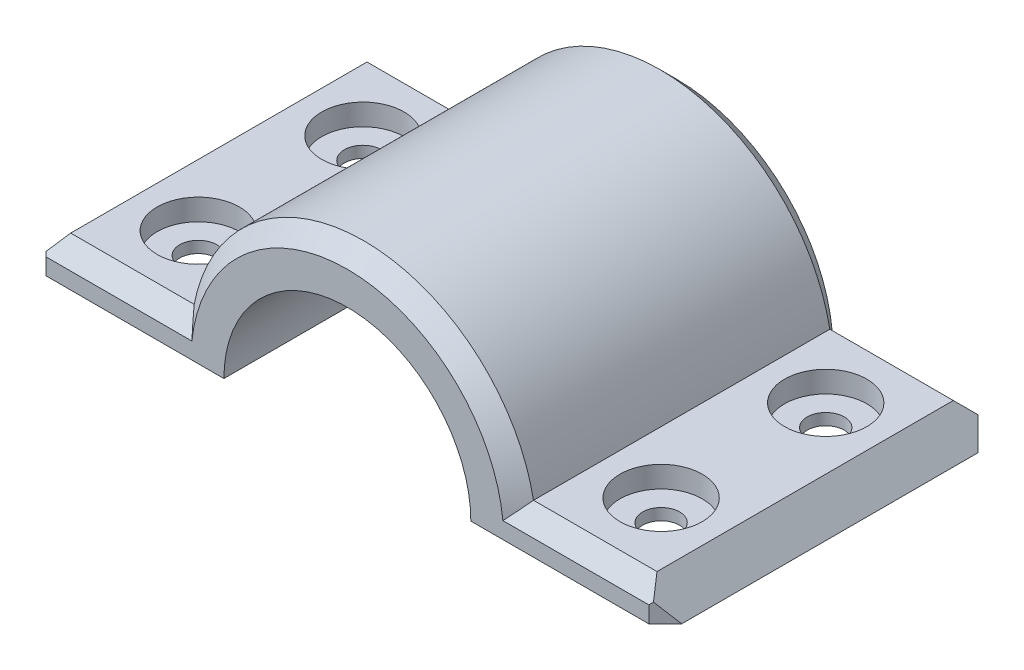
ISO-10303-21;
HEADER;
FILE_DESCRIPTION(('STEP AP214'),'2;1');
FILE_NAME('part.step','',(''),(''),'','','');
FILE_SCHEMA(('AUTOMOTIVE_DESIGN { 1 0 10303 214 1 1 1 1 }'));
ENDSEC;
DATA;
#1=APPLICATION_CONTEXT('core data for automotive mechanical design processes');
#2=APPLICATION_PROTOCOL_DEFINITION('international standard','automotive_design',2000,#1);
#3=PRODUCT_CONTEXT('',#1,'mechanical');
#4=PRODUCT('Part','Part','',(#3));
#5=PRODUCT_RELATED_PRODUCT_CATEGORY('part','',(#4));
#6=PRODUCT_DEFINITION_FORMATION('','',#4);
#7=PRODUCT_DEFINITION_CONTEXT('part definition',#1,'design');
#8=PRODUCT_DEFINITION('design','',#6,#7);
#9=PRODUCT_DEFINITION_SHAPE('','',#8);
#10=(LENGTH_UNIT() NAMED_UNIT(*) SI_UNIT(.MILLI.,.METRE.));
#11=(NAMED_UNIT(*) PLANE_ANGLE_UNIT() SI_UNIT($,.RADIAN.));
#12=(NAMED_UNIT(*) SI_UNIT($,.STERADIAN.) SOLID_ANGLE_UNIT());
#13=UNCERTAINTY_MEASURE_WITH_UNIT(LENGTH_MEASURE(1.E-05),#10,'distance_accuracy_value','');
#14=(GEOMETRIC_REPRESENTATION_CONTEXT(3) GLOBAL_UNCERTAINTY_ASSIGNED_CONTEXT((#13)) GLOBAL_UNIT_ASSIGNED_CONTEXT((#10,
#11,#12)) REPRESENTATION_CONTEXT('',''));
#15=CARTESIAN_POINT('',(0.,0.,0.));
#16=DIRECTION('',(0.,0.,1.));
#17=DIRECTION('',(1.,0.,0.));
#18=AXIS2_PLACEMENT_3D('',#15,#16,#17);
#19=CARTESIAN_POINT('',(0.,0.,40.));
#20=DIRECTION('',(0.,0.,-1.));
#21=DIRECTION('',(-1.,0.,0.));
#22=AXIS2_PLACEMENT_3D('',#19,#20,#21);
#23=CYLINDRICAL_SURFACE('',#22,15.);
#24=CARTESIAN_POINT('',(0.,0.,0.));
#25=DIRECTION('',(0.,0.,-1.));
#26=DIRECTION('',(1.,0.,0.));
#27=AXIS2_PLACEMENT_3D('',#24,#25,#26);
#28=CIRCLE('',#27,15.);
#29=CARTESIAN_POINT('',(-15.,-1.04744440165294E-13,0.));
#30=VERTEX_POINT('',#29);
#31=CARTESIAN_POINT('',(15.,0.,0.));
#32=VERTEX_POINT('',#31);
#33=EDGE_CURVE('E203',#30,#32,#28,.T.);
#34=ORIENTED_EDGE('',*,*,#33,.T.);
#35=DIRECTION('',(0.,0.,-1.));
#36=VECTOR('',#35,1.);
#37=CARTESIAN_POINT('',(15.,0.,40.));
#38=LINE('',#37,#36);
#39=CARTESIAN_POINT('',(15.,0.,40.));
#40=VERTEX_POINT('',#39);
#41=EDGE_CURVE('E196',#40,#32,#38,.T.);
#42=ORIENTED_EDGE('',*,*,#41,.F.);
#43=CARTESIAN_POINT('',(0.,0.,40.));
#44=DIRECTION('',(0.,0.,-1.));
#45=DIRECTION('',(1.,0.,0.));
#46=AXIS2_PLACEMENT_3D('',#43,#44,#45);
#47=CIRCLE('',#46,15.);
#48=CARTESIAN_POINT('',(-15.,-1.04744440165294E-13,40.));
#49=VERTEX_POINT('',#48);
#50=EDGE_CURVE('E400',#49,#40,#47,.T.);
#51=ORIENTED_EDGE('',*,*,#50,.F.);
#52=DIRECTION('',(0.,0.,-1.));
#53=VECTOR('',#52,1.);
#54=CARTESIAN_POINT('',(-15.,-1.04744440165294E-13,40.));
#55=LINE('',#54,#53);
#56=EDGE_CURVE('E176',#49,#30,#55,.T.);
#57=ORIENTED_EDGE('',*,*,#56,.T.);
#58=EDGE_LOOP('',(#34,#42,#51,#57));
#59=FACE_BOUND('',#58,.T.);
#60=ADVANCED_FACE('F39',(#59),#23,.F.);
#61=CARTESIAN_POINT('',(15.,0.,40.));
#62=DIRECTION('',(0.,1.,0.));
#63=DIRECTION('',(0.,0.,1.));
#64=AXIS2_PLACEMENT_3D('',#61,#62,#63);
#65=PLANE('',#64);
#66=CARTESIAN_POINT('',(28.1155281280883,0.,30.));
#67=DIRECTION('',(0.,1.,0.));
#68=DIRECTION('',(0.,0.,1.));
#69=AXIS2_PLACEMENT_3D('',#66,#67,#68);
#70=CIRCLE('',#69,2.24999999999999);
#71=CARTESIAN_POINT('',(28.1155281280883,0.,32.25));
#72=VERTEX_POINT('',#71);
#73=EDGE_CURVE('E205',#72,#72,#70,.T.);
#74=ORIENTED_EDGE('',*,*,#73,.T.);
#75=EDGE_LOOP('',(#74));
#76=FACE_BOUND('',#75,.T.);
#77=CARTESIAN_POINT('',(28.1155281280883,0.,10.));
#78=DIRECTION('',(0.,1.,0.));
#79=DIRECTION('',(0.,0.,1.));
#80=AXIS2_PLACEMENT_3D('',#77,#78,#79);
#81=CIRCLE('',#80,2.24999999999999);
#82=CARTESIAN_POINT('',(28.1155281280883,0.,12.25));
#83=VERTEX_POINT('',#82);
#84=EDGE_CURVE('E200',#83,#83,#81,.T.);
#85=ORIENTED_EDGE('',*,*,#84,.T.);
#86=EDGE_LOOP('',(#85));
#87=FACE_BOUND('',#86,.T.);
#88=DIRECTION('',(0.,0.,-1.));
#89=VECTOR('',#88,1.);
#90=CARTESIAN_POINT('',(38.6155281280883,0.,40.));
#91=LINE('',#90,#89);
#92=CARTESIAN_POINT('',(38.6155281280883,-1.71275520645796E-13,38.));
#93=VERTEX_POINT('',#92);
#94=CARTESIAN_POINT('',(38.6155281280883,-1.71275520645796E-13,2.));
#95=VERTEX_POINT('',#94);
#96=EDGE_CURVE('E193',#93,#95,#91,.T.);
#97=ORIENTED_EDGE('',*,*,#96,.F.);
#98=DIRECTION('',(0.707106781186547,0.,-0.707106781186547));
#99=VECTOR('',#98,1.);
#100=CARTESIAN_POINT('',(38.6155281280883,-1.71275520645796E-13,38.));
#101=LINE('',#100,#99);
#102=CARTESIAN_POINT('',(36.6155281280883,-1.62404709915063E-13,40.));
#103=VERTEX_POINT('',#102);
#104=EDGE_CURVE('E355',#103,#93,#101,.T.);
#105=ORIENTED_EDGE('',*,*,#104,.F.);
#106=DIRECTION('',(1.,0.,0.));
#107=VECTOR('',#106,1.);
#108=CARTESIAN_POINT('',(15.,0.,40.));
#109=LINE('',#108,#107);
#110=EDGE_CURVE('E403',#40,#103,#109,.T.);
#111=ORIENTED_EDGE('',*,*,#110,.F.);
#112=ORIENTED_EDGE('',*,*,#41,.T.);
#113=DIRECTION('',(1.,0.,0.));
#114=VECTOR('',#113,1.);
#115=CARTESIAN_POINT('',(15.,0.,0.));
#116=LINE('',#115,#114);
#117=CARTESIAN_POINT('',(36.6155281280883,-1.62404709915063E-13,0.));
#118=VERTEX_POINT('',#117);
#119=EDGE_CURVE('E359',#32,#118,#116,.T.);
#120=ORIENTED_EDGE('',*,*,#119,.T.);
#121=DIRECTION('',(-0.707106781186548,0.,-0.707106781186547));
#122=VECTOR('',#121,1.);
#123=CARTESIAN_POINT('',(36.6155281280883,-1.62404709915063E-13,0.));
#124=LINE('',#123,#122);
#125=EDGE_CURVE('E358',#95,#118,#124,.T.);
#126=ORIENTED_EDGE('',*,*,#125,.F.);
#127=EDGE_LOOP('',(#97,#105,#111,#112,#120,#126));
#128=FACE_BOUND('',#127,.T.);
#129=ADVANCED_FACE('F354',(#76,#87,#128),#65,.F.);
#130=CARTESIAN_POINT('',(38.6155281280883,0.,40.));
#131=DIRECTION('',(-0.8,-0.6,0.));
#132=DIRECTION('',(0.6,-0.8,0.));
#133=AXIS2_PLACEMENT_3D('',#130,#131,#132);
#134=PLANE('',#133);
#135=DIRECTION('',(0.468521285665818,-0.624695047554424,0.624695047554424));
#136=VECTOR('',#135,1.);
#137=CARTESIAN_POINT('',(28.9682170755811,12.8630814033429,29.1369185966571));
#138=LINE('',#137,#136);
#139=CARTESIAN_POINT('',(35.6155281280883,4.,38.));
#140=VERTEX_POINT('',#139);
#141=CARTESIAN_POINT('',(36.9012424138026,2.28571428571428,39.7142857142857));
#142=VERTEX_POINT('',#141);
#143=EDGE_CURVE('E231',#140,#142,#138,.T.);
#144=ORIENTED_EDGE('',*,*,#143,.T.);
#145=DIRECTION('',(0.514495755427526,-0.685994340570034,-0.514495755427529));
#146=VECTOR('',#145,1.);
#147=CARTESIAN_POINT('',(38.0861163633824,0.70588235294118,38.5294117647059));
#148=LINE('',#147,#146);
#149=EDGE_CURVE('E348',#142,#93,#148,.T.);
#150=ORIENTED_EDGE('',*,*,#149,.T.);
#151=ORIENTED_EDGE('',*,*,#96,.T.);
#152=DIRECTION('',(-0.514495755427526,0.685994340570034,-0.514495755427529));
#153=VECTOR('',#152,1.);
#154=CARTESIAN_POINT('',(48.6743516575001,-13.4117647058824,12.0588235294119));
#155=LINE('',#154,#153);
#156=CARTESIAN_POINT('',(36.9012424138026,2.28571428571427,0.285714285714287));
#157=VERTEX_POINT('',#156);
#158=EDGE_CURVE('E170',#95,#157,#155,.T.);
#159=ORIENTED_EDGE('',*,*,#158,.T.);
#160=DIRECTION('',(0.468521285665818,-0.624695047554424,-0.624695047554424));
#161=VECTOR('',#160,1.);
#162=CARTESIAN_POINT('',(35.6155281280883,4.,2.00000000000002));
#163=LINE('',#162,#161);
#164=CARTESIAN_POINT('',(35.6155281280883,4.,2.00000000000002));
#165=VERTEX_POINT('',#164);
#166=EDGE_CURVE('E234',#157,#165,#163,.F.);
#167=ORIENTED_EDGE('',*,*,#166,.T.);
#168=DIRECTION('',(0.,0.,-1.));
#169=VECTOR('',#168,1.);
#170=CARTESIAN_POINT('',(35.6155281280883,4.,40.));
#171=LINE('',#170,#169);
#172=EDGE_CURVE('E190',#140,#165,#171,.T.);
#173=ORIENTED_EDGE('',*,*,#172,.F.);
#174=EDGE_LOOP('',(#144,#150,#151,#159,#167,#173));
#175=FACE_BOUND('',#174,.T.);
#176=ADVANCED_FACE('F324',(#175),#134,.F.);
#177=CARTESIAN_POINT('',(35.6155281280883,4.,40.));
#178=DIRECTION('',(0.,-1.,0.));
#179=DIRECTION('',(1.,0.,0.));
#180=AXIS2_PLACEMENT_3D('',#177,#178,#179);
#181=PLANE('',#180);
#182=CARTESIAN_POINT('',(28.1155281280883,4.,30.));
#183=DIRECTION('',(0.,1.,0.));
#184=DIRECTION('',(0.,0.,1.));
#185=AXIS2_PLACEMENT_3D('',#182,#183,#184);
#186=CIRCLE('',#185,5.);
#187=CARTESIAN_POINT('',(28.1155281280883,4.,35.));
#188=VERTEX_POINT('',#187);
#189=EDGE_CURVE('E213',#188,#188,#186,.T.);
#190=ORIENTED_EDGE('',*,*,#189,.F.);
#191=EDGE_LOOP('',(#190));
#192=FACE_BOUND('',#191,.T.);
#193=CARTESIAN_POINT('',(28.1155281280883,4.,10.));
#194=DIRECTION('',(0.,1.,0.));
#195=DIRECTION('',(0.,0.,1.));
#196=AXIS2_PLACEMENT_3D('',#193,#194,#195);
#197=CIRCLE('',#196,5.);
#198=CARTESIAN_POINT('',(28.1155281280883,4.,15.));
#199=VERTEX_POINT('',#198);
#200=EDGE_CURVE('E208',#199,#199,#197,.T.);
#201=ORIENTED_EDGE('',*,*,#200,.F.);
#202=EDGE_LOOP('',(#201));
#203=FACE_BOUND('',#202,.T.);
#204=ORIENTED_EDGE('',*,*,#172,.T.);
#205=DIRECTION('',(-1.,0.,0.));
#206=VECTOR('',#205,1.);
#207=CARTESIAN_POINT('',(35.6155281280883,4.,2.00000000000002));
#208=LINE('',#207,#206);
#209=CARTESIAN_POINT('',(20.6155281280883,4.,2.00000000000002));
#210=VERTEX_POINT('',#209);
#211=EDGE_CURVE('E221',#165,#210,#208,.T.);
#212=ORIENTED_EDGE('',*,*,#211,.T.);
#213=DIRECTION('',(0.,0.,-1.));
#214=VECTOR('',#213,1.);
#215=CARTESIAN_POINT('',(20.6155281280883,4.,40.));
#216=LINE('',#215,#214);
#217=CARTESIAN_POINT('',(20.6155281280883,4.,38.));
#218=VERTEX_POINT('',#217);
#219=EDGE_CURVE('E187',#218,#210,#216,.T.);
#220=ORIENTED_EDGE('',*,*,#219,.F.);
#221=DIRECTION('',(1.,0.,0.));
#222=VECTOR('',#221,1.);
#223=CARTESIAN_POINT('',(35.6155281280883,4.,38.));
#224=LINE('',#223,#222);
#225=EDGE_CURVE('E199',#218,#140,#224,.T.);
#226=ORIENTED_EDGE('',*,*,#225,.T.);
#227=EDGE_LOOP('',(#204,#212,#220,#226));
#228=FACE_BOUND('',#227,.T.);
#229=ADVANCED_FACE('F335',(#192,#203,#228),#181,.F.);
#230=CARTESIAN_POINT('',(0.,0.,40.));
#231=DIRECTION('',(0.,0.,-1.));
#232=DIRECTION('',(-1.,0.,0.));
#233=AXIS2_PLACEMENT_3D('',#230,#231,#232);
#234=CYLINDRICAL_SURFACE('',#233,21.);
#235=ORIENTED_EDGE('',*,*,#219,.T.);
#236=CARTESIAN_POINT('',(0.,0.,2.00000000000002));
#237=DIRECTION('',(0.,0.,1.));
#238=DIRECTION('',(1.,0.,0.));
#239=AXIS2_PLACEMENT_3D('',#236,#237,#238);
#240=CIRCLE('',#239,21.);
#241=CARTESIAN_POINT('',(-20.6155281280883,4.,2.00000000000002));
#242=VERTEX_POINT('',#241);
#243=EDGE_CURVE('E238',#210,#242,#240,.T.);
#244=ORIENTED_EDGE('',*,*,#243,.T.);
#245=DIRECTION('',(0.,0.,-1.));
#246=VECTOR('',#245,1.);
#247=CARTESIAN_POINT('',(-20.6155281280883,4.,40.));
#248=LINE('',#247,#246);
#249=CARTESIAN_POINT('',(-20.6155281280883,4.,38.));
#250=VERTEX_POINT('',#249);
#251=EDGE_CURVE('E178',#250,#242,#248,.T.);
#252=ORIENTED_EDGE('',*,*,#251,.F.);
#253=CARTESIAN_POINT('',(0.,0.,38.));
#254=DIRECTION('',(0.,0.,1.));
#255=DIRECTION('',(1.,0.,0.));
#256=AXIS2_PLACEMENT_3D('',#253,#254,#255);
#257=CIRCLE('',#256,21.);
#258=EDGE_CURVE('E236',#250,#218,#257,.F.);
#259=ORIENTED_EDGE('',*,*,#258,.T.);
#260=EDGE_LOOP('',(#235,#244,#252,#259));
#261=FACE_BOUND('',#260,.T.);
#262=ADVANCED_FACE('F338',(#261),#234,.T.);
#263=CARTESIAN_POINT('',(-35.6155281280883,4.,40.));
#264=DIRECTION('',(0.,-1.,0.));
#265=DIRECTION('',(0.,0.,-1.));
#266=AXIS2_PLACEMENT_3D('',#263,#264,#265);
#267=PLANE('',#266);
#268=CARTESIAN_POINT('',(-28.1155281280883,4.,10.));
#269=DIRECTION('',(0.,1.,0.));
#270=DIRECTION('',(0.,0.,1.));
#271=AXIS2_PLACEMENT_3D('',#268,#269,#270);
#272=CIRCLE('',#271,5.);
#273=CARTESIAN_POINT('',(-28.1155281280883,4.,15.));
#274=VERTEX_POINT('',#273);
#275=EDGE_CURVE('E371',#274,#274,#272,.T.);
#276=ORIENTED_EDGE('',*,*,#275,.F.);
#277=EDGE_LOOP('',(#276));
#278=FACE_BOUND('',#277,.T.);
#279=CARTESIAN_POINT('',(-28.1155281280883,4.,30.));
#280=DIRECTION('',(0.,1.,0.));
#281=DIRECTION('',(0.,0.,1.));
#282=AXIS2_PLACEMENT_3D('',#279,#280,#281);
#283=CIRCLE('',#282,5.);
#284=CARTESIAN_POINT('',(-28.1155281280883,4.,35.));
#285=VERTEX_POINT('',#284);
#286=EDGE_CURVE('E218',#285,#285,#283,.T.);
#287=ORIENTED_EDGE('',*,*,#286,.F.);
#288=EDGE_LOOP('',(#287));
#289=FACE_BOUND('',#288,.T.);
#290=ORIENTED_EDGE('',*,*,#251,.T.);
#291=DIRECTION('',(-1.,0.,0.));
#292=VECTOR('',#291,1.);
#293=CARTESIAN_POINT('',(-35.6155281280883,4.,2.00000000000002));
#294=LINE('',#293,#292);
#295=CARTESIAN_POINT('',(-35.6155281280883,4.,2.00000000000002));
#296=VERTEX_POINT('',#295);
#297=EDGE_CURVE('E242',#242,#296,#294,.T.);
#298=ORIENTED_EDGE('',*,*,#297,.T.);
#299=DIRECTION('',(0.,0.,-1.));
#300=VECTOR('',#299,1.);
#301=CARTESIAN_POINT('',(-35.6155281280883,4.,40.));
#302=LINE('',#301,#300);
#303=CARTESIAN_POINT('',(-35.6155281280883,4.,38.));
#304=VERTEX_POINT('',#303);
#305=EDGE_CURVE('E175',#304,#296,#302,.T.);
#306=ORIENTED_EDGE('',*,*,#305,.F.);
#307=DIRECTION('',(1.,0.,0.));
#308=VECTOR('',#307,1.);
#309=CARTESIAN_POINT('',(-20.6155281280883,4.,38.));
#310=LINE('',#309,#308);
#311=EDGE_CURVE('E240',#304,#250,#310,.T.);
#312=ORIENTED_EDGE('',*,*,#311,.T.);
#313=EDGE_LOOP('',(#290,#298,#306,#312));
#314=FACE_BOUND('',#313,.T.);
#315=ADVANCED_FACE('F428',(#278,#289,#314),#267,.F.);
#316=CARTESIAN_POINT('',(-38.6155281280883,0.,40.));
#317=DIRECTION('',(0.8,-0.6,0.));
#318=DIRECTION('',(0.6,0.8,0.));
#319=AXIS2_PLACEMENT_3D('',#316,#317,#318);
#320=PLANE('',#319);
#321=DIRECTION('',(0.468521285665819,0.624695047554424,0.624695047554424));
#322=VECTOR('',#321,1.);
#323=CARTESIAN_POINT('',(-35.6155281280883,4.,2.00000000000002));
#324=LINE('',#323,#322);
#325=CARTESIAN_POINT('',(-36.9012424138026,2.28571428571428,0.285714285714296));
#326=VERTEX_POINT('',#325);
#327=EDGE_CURVE('E168',#296,#326,#324,.F.);
#328=ORIENTED_EDGE('',*,*,#327,.T.);
#329=DIRECTION('',(-0.514495755427527,-0.685994340570036,0.514495755427525));
#330=VECTOR('',#329,1.);
#331=CARTESIAN_POINT('',(-48.6743516575001,-13.4117647058823,12.0588235294117));
#332=LINE('',#331,#330);
#333=CARTESIAN_POINT('',(-38.6155281280883,1.71275520645796E-13,2.));
#334=VERTEX_POINT('',#333);
#335=EDGE_CURVE('E55',#326,#334,#332,.T.);
#336=ORIENTED_EDGE('',*,*,#335,.T.);
#337=DIRECTION('',(0.,0.,-1.));
#338=VECTOR('',#337,1.);
#339=CARTESIAN_POINT('',(-38.6155281280883,0.,40.));
#340=LINE('',#339,#338);
#341=CARTESIAN_POINT('',(-38.6155281280883,1.71275520645796E-13,38.));
#342=VERTEX_POINT('',#341);
#343=EDGE_CURVE('E165',#342,#334,#340,.T.);
#344=ORIENTED_EDGE('',*,*,#343,.F.);
#345=DIRECTION('',(0.514495755427528,0.685994340570036,0.514495755427525));
#346=VECTOR('',#345,1.);
#347=CARTESIAN_POINT('',(-38.0861163633824,0.705882352941174,38.5294117647059));
#348=LINE('',#347,#346);
#349=CARTESIAN_POINT('',(-36.9012424138026,2.28571428571428,39.7142857142857));
#350=VERTEX_POINT('',#349);
#351=EDGE_CURVE('E328',#342,#350,#348,.T.);
#352=ORIENTED_EDGE('',*,*,#351,.T.);
#353=DIRECTION('',(0.468521285665819,0.624695047554424,-0.624695047554424));
#354=VECTOR('',#353,1.);
#355=CARTESIAN_POINT('',(-28.9682170755811,12.8630814033429,29.1369185966571));
#356=LINE('',#355,#354);
#357=EDGE_CURVE('E244',#350,#304,#356,.T.);
#358=ORIENTED_EDGE('',*,*,#357,.T.);
#359=ORIENTED_EDGE('',*,*,#305,.T.);
#360=EDGE_LOOP('',(#328,#336,#344,#352,#358,#359));
#361=FACE_BOUND('',#360,.T.);
#362=ADVANCED_FACE('F163',(#361),#320,.F.);
#363=CARTESIAN_POINT('',(-15.,-1.04744440165294E-13,40.));
#364=DIRECTION('',(0.,1.,0.));
#365=DIRECTION('',(-1.,0.,0.));
#366=AXIS2_PLACEMENT_3D('',#363,#364,#365);
#367=PLANE('',#366);
#368=CARTESIAN_POINT('',(-28.1155281280883,0.,10.));
#369=DIRECTION('',(0.,1.,0.));
#370=DIRECTION('',(-1.,0.,0.));
#371=AXIS2_PLACEMENT_3D('',#368,#369,#370);
#372=CIRCLE('',#371,2.24999999999999);
#373=CARTESIAN_POINT('',(-30.3655281280883,0.,10.));
#374=VERTEX_POINT('',#373);
#375=EDGE_CURVE('E215',#374,#374,#372,.T.);
#376=ORIENTED_EDGE('',*,*,#375,.T.);
#377=EDGE_LOOP('',(#376));
#378=FACE_BOUND('',#377,.T.);
#379=CARTESIAN_POINT('',(-28.1155281280883,0.,30.));
#380=DIRECTION('',(0.,1.,0.));
#381=DIRECTION('',(-1.,0.,0.));
#382=AXIS2_PLACEMENT_3D('',#379,#380,#381);
#383=CIRCLE('',#382,2.24999999999999);
#384=CARTESIAN_POINT('',(-30.3655281280883,0.,30.));
#385=VERTEX_POINT('',#384);
#386=EDGE_CURVE('E210',#385,#385,#383,.T.);
#387=ORIENTED_EDGE('',*,*,#386,.T.);
#388=EDGE_LOOP('',(#387));
#389=FACE_BOUND('',#388,.T.);
#390=ORIENTED_EDGE('',*,*,#343,.T.);
#391=DIRECTION('',(-0.707106781186547,0.,0.707106781186549));
#392=VECTOR('',#391,1.);
#393=CARTESIAN_POINT('',(-38.6155281280883,1.71275520645796E-13,2.));
#394=LINE('',#393,#392);
#395=CARTESIAN_POINT('',(-36.6155281280883,1.62404709915063E-13,0.));
#396=VERTEX_POINT('',#395);
#397=EDGE_CURVE('E151',#396,#334,#394,.T.);
#398=ORIENTED_EDGE('',*,*,#397,.F.);
#399=DIRECTION('',(1.,0.,0.));
#400=VECTOR('',#399,1.);
#401=CARTESIAN_POINT('',(-15.,-1.04744440165294E-13,0.));
#402=LINE('',#401,#400);
#403=EDGE_CURVE('E404',#396,#30,#402,.T.);
#404=ORIENTED_EDGE('',*,*,#403,.T.);
#405=ORIENTED_EDGE('',*,*,#56,.F.);
#406=DIRECTION('',(1.,0.,0.));
#407=VECTOR('',#406,1.);
#408=CARTESIAN_POINT('',(-15.,-1.04744440165294E-13,40.));
#409=LINE('',#408,#407);
#410=CARTESIAN_POINT('',(-36.6155281280883,1.62404709915063E-13,40.));
#411=VERTEX_POINT('',#410);
#412=EDGE_CURVE('E181',#411,#49,#409,.T.);
#413=ORIENTED_EDGE('',*,*,#412,.F.);
#414=DIRECTION('',(0.707106781186547,0.,0.707106781186547));
#415=VECTOR('',#414,1.);
#416=CARTESIAN_POINT('',(-38.6155281280883,1.71275520645796E-13,38.));
#417=LINE('',#416,#415);
#418=EDGE_CURVE('E158',#342,#411,#417,.T.);
#419=ORIENTED_EDGE('',*,*,#418,.F.);
#420=EDGE_LOOP('',(#390,#398,#404,#405,#413,#419));
#421=FACE_BOUND('',#420,.T.);
#422=ADVANCED_FACE('F173',(#378,#389,#421),#367,.F.);
#423=CARTESIAN_POINT('',(0.,0.,40.));
#424=DIRECTION('',(0.,0.,1.));
#425=DIRECTION('',(1.,0.,0.));
#426=AXIS2_PLACEMENT_3D('',#423,#424,#425);
#427=PLANE('',#426);
#428=DIRECTION('',(0.,-1.,0.));
#429=VECTOR('',#428,1.);
#430=CARTESIAN_POINT('',(36.6155281280883,9.99999999999984,40.));
#431=LINE('',#430,#429);
#432=CARTESIAN_POINT('',(36.6155281280883,1.99999999999999,40.));
#433=VERTEX_POINT('',#432);
#434=EDGE_CURVE('E364',#433,#103,#431,.T.);
#435=ORIENTED_EDGE('',*,*,#434,.F.);
#436=DIRECTION('',(-1.,0.,0.));
#437=VECTOR('',#436,1.);
#438=CARTESIAN_POINT('',(20.6155281280883,1.99999999999999,40.));
#439=LINE('',#438,#437);
#440=CARTESIAN_POINT('',(18.8944436276912,1.99999999999999,40.));
#441=VERTEX_POINT('',#440);
#442=EDGE_CURVE('E252',#433,#441,#439,.T.);
#443=ORIENTED_EDGE('',*,*,#442,.T.);
#444=CARTESIAN_POINT('',(0.,0.,40.));
#445=DIRECTION('',(0.,0.,1.));
#446=DIRECTION('',(1.,0.,0.));
#447=AXIS2_PLACEMENT_3D('',#444,#445,#446);
#448=CIRCLE('',#447,19.);
#449=CARTESIAN_POINT('',(-18.8944436276912,1.99999999999999,40.));
#450=VERTEX_POINT('',#449);
#451=EDGE_CURVE('E247',#441,#450,#448,.T.);
#452=ORIENTED_EDGE('',*,*,#451,.T.);
#453=DIRECTION('',(-1.,0.,0.));
#454=VECTOR('',#453,1.);
#455=CARTESIAN_POINT('',(-35.6155281280883,1.99999999999999,40.));
#456=LINE('',#455,#454);
#457=CARTESIAN_POINT('',(-36.6155281280883,1.99999999999999,40.));
#458=VERTEX_POINT('',#457);
#459=EDGE_CURVE('E249',#450,#458,#456,.T.);
#460=ORIENTED_EDGE('',*,*,#459,.T.);
#461=DIRECTION('',(0.,-1.,0.));
#462=VECTOR('',#461,1.);
#463=CARTESIAN_POINT('',(-36.6155281280883,10.0000000000002,40.));
#464=LINE('',#463,#462);
#465=EDGE_CURVE('E350',#458,#411,#464,.T.);
#466=ORIENTED_EDGE('',*,*,#465,.T.);
#467=ORIENTED_EDGE('',*,*,#412,.T.);
#468=ORIENTED_EDGE('',*,*,#50,.T.);
#469=ORIENTED_EDGE('',*,*,#110,.T.);
#470=EDGE_LOOP('',(#435,#443,#452,#460,#466,#467,#468,#469));
#471=FACE_BOUND('',#470,.T.);
#472=ADVANCED_FACE('F418',(#471),#427,.T.);
#473=CARTESIAN_POINT('',(0.,0.,0.));
#474=DIRECTION('',(0.,0.,1.));
#475=DIRECTION('',(1.,0.,0.));
#476=AXIS2_PLACEMENT_3D('',#473,#474,#475);
#477=PLANE('',#476);
#478=DIRECTION('',(1.,0.,0.));
#479=VECTOR('',#478,1.);
#480=CARTESIAN_POINT('',(0.,1.99999999999998,0.));
#481=LINE('',#480,#479);
#482=CARTESIAN_POINT('',(18.8944436276912,1.99999999999998,0.));
#483=VERTEX_POINT('',#482);
#484=CARTESIAN_POINT('',(36.6155281280883,1.99999999999999,0.));
#485=VERTEX_POINT('',#484);
#486=EDGE_CURVE('E228',#483,#485,#481,.T.);
#487=ORIENTED_EDGE('',*,*,#486,.T.);
#488=DIRECTION('',(0.,-1.,0.));
#489=VECTOR('',#488,1.);
#490=CARTESIAN_POINT('',(36.6155281280883,9.99999999999984,0.));
#491=LINE('',#490,#489);
#492=EDGE_CURVE('E63',#485,#118,#491,.T.);
#493=ORIENTED_EDGE('',*,*,#492,.T.);
#494=ORIENTED_EDGE('',*,*,#119,.F.);
#495=ORIENTED_EDGE('',*,*,#33,.F.);
#496=ORIENTED_EDGE('',*,*,#403,.F.);
#497=DIRECTION('',(0.,-1.,0.));
#498=VECTOR('',#497,1.);
#499=CARTESIAN_POINT('',(-36.6155281280883,10.0000000000002,0.));
#500=LINE('',#499,#498);
#501=CARTESIAN_POINT('',(-36.6155281280883,1.99999999999998,0.));
#502=VERTEX_POINT('',#501);
#503=EDGE_CURVE('E154',#502,#396,#500,.T.);
#504=ORIENTED_EDGE('',*,*,#503,.F.);
#505=DIRECTION('',(1.,0.,0.));
#506=VECTOR('',#505,1.);
#507=CARTESIAN_POINT('',(0.,1.99999999999998,0.));
#508=LINE('',#507,#506);
#509=CARTESIAN_POINT('',(-18.8944436276912,1.99999999999998,0.));
#510=VERTEX_POINT('',#509);
#511=EDGE_CURVE('E224',#502,#510,#508,.T.);
#512=ORIENTED_EDGE('',*,*,#511,.T.);
#513=CARTESIAN_POINT('',(0.,0.,0.));
#514=DIRECTION('',(0.,0.,1.));
#515=DIRECTION('',(1.,0.,0.));
#516=AXIS2_PLACEMENT_3D('',#513,#514,#515);
#517=CIRCLE('',#516,19.);
#518=EDGE_CURVE('E226',#510,#483,#517,.F.);
#519=ORIENTED_EDGE('',*,*,#518,.T.);
#520=EDGE_LOOP('',(#487,#493,#494,#495,#496,#504,#512,#519));
#521=FACE_BOUND('',#520,.T.);
#522=ADVANCED_FACE('F415',(#521),#477,.F.);
#523=CARTESIAN_POINT('',(28.1155281280883,4.,10.));
#524=DIRECTION('',(0.,1.,0.));
#525=DIRECTION('',(0.,0.,1.));
#526=AXIS2_PLACEMENT_3D('',#523,#524,#525);
#527=CYLINDRICAL_SURFACE('',#526,2.24999999999999);
#528=CARTESIAN_POINT('',(28.1155281280883,1.4,10.));
#529=DIRECTION('',(0.,1.,0.));
#530=DIRECTION('',(0.,0.,1.));
#531=AXIS2_PLACEMENT_3D('',#528,#529,#530);
#532=CIRCLE('',#531,2.24999999999999);
#533=CARTESIAN_POINT('',(28.1155281280883,1.4,12.25));
#534=VERTEX_POINT('',#533);
#535=EDGE_CURVE('E204',#534,#534,#532,.T.);
#536=ORIENTED_EDGE('',*,*,#535,.T.);
#537=EDGE_LOOP('',(#536));
#538=FACE_BOUND('',#537,.T.);
#539=ORIENTED_EDGE('',*,*,#84,.F.);
#540=EDGE_LOOP('',(#539));
#541=FACE_BOUND('',#540,.T.);
#542=ADVANCED_FACE('F478',(#538,#541),#527,.F.);
#543=CARTESIAN_POINT('',(30.3655281280883,1.4,10.));
#544=DIRECTION('',(0.,-1.,0.));
#545=DIRECTION('',(0.,0.,-1.));
#546=AXIS2_PLACEMENT_3D('',#543,#544,#545);
#547=PLANE('',#546);
#548=ORIENTED_EDGE('',*,*,#535,.F.);
#549=EDGE_LOOP('',(#548));
#550=FACE_BOUND('',#549,.T.);
#551=CARTESIAN_POINT('',(28.1155281280883,1.4,10.));
#552=DIRECTION('',(0.,1.,0.));
#553=DIRECTION('',(0.,0.,1.));
#554=AXIS2_PLACEMENT_3D('',#551,#552,#553);
#555=CIRCLE('',#554,5.);
#556=CARTESIAN_POINT('',(28.1155281280883,1.4,15.));
#557=VERTEX_POINT('',#556);
#558=EDGE_CURVE('E395',#557,#557,#555,.T.);
#559=ORIENTED_EDGE('',*,*,#558,.T.);
#560=EDGE_LOOP('',(#559));
#561=FACE_BOUND('',#560,.T.);
#562=ADVANCED_FACE('F468',(#550,#561),#547,.F.);
#563=CARTESIAN_POINT('',(28.1155281280883,4.,10.));
#564=DIRECTION('',(0.,1.,0.));
#565=DIRECTION('',(0.,0.,1.));
#566=AXIS2_PLACEMENT_3D('',#563,#564,#565);
#567=CYLINDRICAL_SURFACE('',#566,5.);
#568=ORIENTED_EDGE('',*,*,#558,.F.);
#569=EDGE_LOOP('',(#568));
#570=FACE_BOUND('',#569,.T.);
#571=ORIENTED_EDGE('',*,*,#200,.T.);
#572=EDGE_LOOP('',(#571));
#573=FACE_BOUND('',#572,.T.);
#574=ADVANCED_FACE('F465',(#570,#573),#567,.F.);
#575=CARTESIAN_POINT('',(28.1155281280883,4.,30.));
#576=DIRECTION('',(0.,1.,0.));
#577=DIRECTION('',(0.,0.,1.));
#578=AXIS2_PLACEMENT_3D('',#575,#576,#577);
#579=CYLINDRICAL_SURFACE('',#578,2.24999999999999);
#580=CARTESIAN_POINT('',(28.1155281280883,1.4,30.));
#581=DIRECTION('',(0.,1.,0.));
#582=DIRECTION('',(0.,0.,1.));
#583=AXIS2_PLACEMENT_3D('',#580,#581,#582);
#584=CIRCLE('',#583,2.24999999999999);
#585=CARTESIAN_POINT('',(28.1155281280883,1.4,32.25));
#586=VERTEX_POINT('',#585);
#587=EDGE_CURVE('E209',#586,#586,#584,.T.);
#588=ORIENTED_EDGE('',*,*,#587,.T.);
#589=EDGE_LOOP('',(#588));
#590=FACE_BOUND('',#589,.T.);
#591=ORIENTED_EDGE('',*,*,#73,.F.);
#592=EDGE_LOOP('',(#591));
#593=FACE_BOUND('',#592,.T.);
#594=ADVANCED_FACE('F467',(#590,#593),#579,.F.);
#595=CARTESIAN_POINT('',(30.3655281280883,1.4,30.));
#596=DIRECTION('',(0.,-1.,0.));
#597=DIRECTION('',(0.,0.,-1.));
#598=AXIS2_PLACEMENT_3D('',#595,#596,#597);
#599=PLANE('',#598);
#600=ORIENTED_EDGE('',*,*,#587,.F.);
#601=EDGE_LOOP('',(#600));
#602=FACE_BOUND('',#601,.T.);
#603=CARTESIAN_POINT('',(28.1155281280883,1.4,30.));
#604=DIRECTION('',(0.,1.,0.));
#605=DIRECTION('',(0.,0.,1.));
#606=AXIS2_PLACEMENT_3D('',#603,#604,#605);
#607=CIRCLE('',#606,5.);
#608=CARTESIAN_POINT('',(28.1155281280883,1.4,35.));
#609=VERTEX_POINT('',#608);
#610=EDGE_CURVE('E388',#609,#609,#607,.T.);
#611=ORIENTED_EDGE('',*,*,#610,.T.);
#612=EDGE_LOOP('',(#611));
#613=FACE_BOUND('',#612,.T.);
#614=ADVANCED_FACE('F475',(#602,#613),#599,.F.);
#615=CARTESIAN_POINT('',(28.1155281280883,4.,30.));
#616=DIRECTION('',(0.,1.,0.));
#617=DIRECTION('',(0.,0.,1.));
#618=AXIS2_PLACEMENT_3D('',#615,#616,#617);
#619=CYLINDRICAL_SURFACE('',#618,5.);
#620=ORIENTED_EDGE('',*,*,#610,.F.);
#621=EDGE_LOOP('',(#620));
#622=FACE_BOUND('',#621,.T.);
#623=ORIENTED_EDGE('',*,*,#189,.T.);
#624=EDGE_LOOP('',(#623));
#625=FACE_BOUND('',#624,.T.);
#626=ADVANCED_FACE('F502',(#622,#625),#619,.F.);
#627=CARTESIAN_POINT('',(-28.1155281280883,4.,30.));
#628=DIRECTION('',(0.,1.,0.));
#629=DIRECTION('',(0.,0.,1.));
#630=AXIS2_PLACEMENT_3D('',#627,#628,#629);
#631=CYLINDRICAL_SURFACE('',#630,2.24999999999999);
#632=CARTESIAN_POINT('',(-28.1155281280883,1.4,30.));
#633=DIRECTION('',(0.,1.,0.));
#634=DIRECTION('',(0.,0.,1.));
#635=AXIS2_PLACEMENT_3D('',#632,#633,#634);
#636=CIRCLE('',#635,2.24999999999999);
#637=CARTESIAN_POINT('',(-28.1155281280883,1.4,32.25));
#638=VERTEX_POINT('',#637);
#639=EDGE_CURVE('E214',#638,#638,#636,.T.);
#640=ORIENTED_EDGE('',*,*,#639,.T.);
#641=EDGE_LOOP('',(#640));
#642=FACE_BOUND('',#641,.T.);
#643=ORIENTED_EDGE('',*,*,#386,.F.);
#644=EDGE_LOOP('',(#643));
#645=FACE_BOUND('',#644,.T.);
#646=ADVANCED_FACE('F499',(#642,#645),#631,.F.);
#647=CARTESIAN_POINT('',(-25.8655281280883,1.4,30.));
#648=DIRECTION('',(0.,-1.,0.));
#649=DIRECTION('',(0.,0.,-1.));
#650=AXIS2_PLACEMENT_3D('',#647,#648,#649);
#651=PLANE('',#650);
#652=ORIENTED_EDGE('',*,*,#639,.F.);
#653=EDGE_LOOP('',(#652));
#654=FACE_BOUND('',#653,.T.);
#655=CARTESIAN_POINT('',(-28.1155281280883,1.4,30.));
#656=DIRECTION('',(0.,1.,0.));
#657=DIRECTION('',(0.,0.,1.));
#658=AXIS2_PLACEMENT_3D('',#655,#656,#657);
#659=CIRCLE('',#658,5.);
#660=CARTESIAN_POINT('',(-28.1155281280883,1.4,35.));
#661=VERTEX_POINT('',#660);
#662=EDGE_CURVE('E381',#661,#661,#659,.T.);
#663=ORIENTED_EDGE('',*,*,#662,.T.);
#664=EDGE_LOOP('',(#663));
#665=FACE_BOUND('',#664,.T.);
#666=ADVANCED_FACE('F501',(#654,#665),#651,.F.);
#667=CARTESIAN_POINT('',(-28.1155281280883,4.,30.));
#668=DIRECTION('',(0.,1.,0.));
#669=DIRECTION('',(0.,0.,1.));
#670=AXIS2_PLACEMENT_3D('',#667,#668,#669);
#671=CYLINDRICAL_SURFACE('',#670,5.);
#672=ORIENTED_EDGE('',*,*,#662,.F.);
#673=EDGE_LOOP('',(#672));
#674=FACE_BOUND('',#673,.T.);
#675=ORIENTED_EDGE('',*,*,#286,.T.);
#676=EDGE_LOOP('',(#675));
#677=FACE_BOUND('',#676,.T.);
#678=ADVANCED_FACE('F509',(#674,#677),#671,.F.);
#679=CARTESIAN_POINT('',(-28.1155281280883,4.,10.));
#680=DIRECTION('',(0.,1.,0.));
#681=DIRECTION('',(0.,0.,1.));
#682=AXIS2_PLACEMENT_3D('',#679,#680,#681);
#683=CYLINDRICAL_SURFACE('',#682,2.24999999999999);
#684=CARTESIAN_POINT('',(-28.1155281280883,1.4,10.));
#685=DIRECTION('',(0.,1.,0.));
#686=DIRECTION('',(0.,0.,1.));
#687=AXIS2_PLACEMENT_3D('',#684,#685,#686);
#688=CIRCLE('',#687,2.24999999999999);
#689=CARTESIAN_POINT('',(-28.1155281280883,1.4,12.25));
#690=VERTEX_POINT('',#689);
#691=EDGE_CURVE('E219',#690,#690,#688,.T.);
#692=ORIENTED_EDGE('',*,*,#691,.T.);
#693=EDGE_LOOP('',(#692));
#694=FACE_BOUND('',#693,.T.);
#695=ORIENTED_EDGE('',*,*,#375,.F.);
#696=EDGE_LOOP('',(#695));
#697=FACE_BOUND('',#696,.T.);
#698=ADVANCED_FACE('F556',(#694,#697),#683,.F.);
#699=CARTESIAN_POINT('',(-25.8655281280883,1.4,10.));
#700=DIRECTION('',(0.,-1.,0.));
#701=DIRECTION('',(0.,0.,-1.));
#702=AXIS2_PLACEMENT_3D('',#699,#700,#701);
#703=PLANE('',#702);
#704=ORIENTED_EDGE('',*,*,#691,.F.);
#705=EDGE_LOOP('',(#704));
#706=FACE_BOUND('',#705,.T.);
#707=CARTESIAN_POINT('',(-28.1155281280883,1.4,10.));
#708=DIRECTION('',(0.,1.,0.));
#709=DIRECTION('',(0.,0.,1.));
#710=AXIS2_PLACEMENT_3D('',#707,#708,#709);
#711=CIRCLE('',#710,5.);
#712=CARTESIAN_POINT('',(-28.1155281280883,1.4,15.));
#713=VERTEX_POINT('',#712);
#714=EDGE_CURVE('E374',#713,#713,#711,.T.);
#715=ORIENTED_EDGE('',*,*,#714,.T.);
#716=EDGE_LOOP('',(#715));
#717=FACE_BOUND('',#716,.T.);
#718=ADVANCED_FACE('F566',(#706,#717),#703,.F.);
#719=CARTESIAN_POINT('',(-28.1155281280883,4.,10.));
#720=DIRECTION('',(0.,1.,0.));
#721=DIRECTION('',(0.,0.,1.));
#722=AXIS2_PLACEMENT_3D('',#719,#720,#721);
#723=CYLINDRICAL_SURFACE('',#722,5.);
#724=ORIENTED_EDGE('',*,*,#714,.F.);
#725=EDGE_LOOP('',(#724));
#726=FACE_BOUND('',#725,.T.);
#727=ORIENTED_EDGE('',*,*,#275,.T.);
#728=EDGE_LOOP('',(#727));
#729=FACE_BOUND('',#728,.T.);
#730=ADVANCED_FACE('F290',(#726,#729),#723,.F.);
#731=CARTESIAN_POINT('',(-35.6155281280883,4.,2.00000000000002));
#732=DIRECTION('',(0.,-0.707106781186547,0.707106781186547));
#733=DIRECTION('',(-1.,0.,0.));
#734=AXIS2_PLACEMENT_3D('',#731,#732,#733);
#735=PLANE('',#734);
#736=DIRECTION('',(-0.577350269189623,0.577350269189627,0.577350269189627));
#737=VECTOR('',#736,1.);
#738=CARTESIAN_POINT('',(-37.6155281280883,3.,1.00000000000002));
#739=LINE('',#738,#737);
#740=EDGE_CURVE('E11',#326,#502,#739,.F.);
#741=ORIENTED_EDGE('',*,*,#740,.F.);
#742=ORIENTED_EDGE('',*,*,#327,.F.);
#743=ORIENTED_EDGE('',*,*,#297,.F.);
#744=CARTESIAN_POINT('',(-20.6155281280883,4.,2.00000000000002));
#745=CARTESIAN_POINT('',(-20.4765326392161,3.83144510324109,1.8314451032411));
#746=CARTESIAN_POINT('',(-20.3364898806928,3.66332109717225,1.66332109717227));
#747=CARTESIAN_POINT('',(-20.0542321690775,3.32800872149252,1.32800872149254));
#748=CARTESIAN_POINT('',(-19.9120174203462,3.1608202658545,1.16082026585452));
#749=CARTESIAN_POINT('',(-19.6253104494893,2.8274193677755,0.827419367775512));
#750=CARTESIAN_POINT('',(-19.4808182009975,2.66120693666436,0.66120693666438));
#751=CARTESIAN_POINT('',(-19.1894445896244,2.32981106722428,0.329811067224297));
#752=CARTESIAN_POINT('',(-19.0425630045422,2.16462772659598,0.164627726595993));
#753=CARTESIAN_POINT('',(-18.8944436276912,1.99999999999998,0.));
#754=B_SPLINE_CURVE_WITH_KNOTS('',3,(#744,#745,#746,#747,#748,#749,#750,#751,#752,#753),
.UNSPECIFIED.,.F.,.F.,(4,2,2,2,4),(0.,0.827810076649309,1.65554273941445,2.48328499172103,
3.31110466662378),.UNSPECIFIED.);
#755=EDGE_CURVE('E263',#510,#242,#754,.F.);
#756=ORIENTED_EDGE('',*,*,#755,.F.);
#757=ORIENTED_EDGE('',*,*,#511,.F.);
#758=EDGE_LOOP('',(#741,#742,#743,#756,#757));
#759=FACE_BOUND('',#758,.T.);
#760=ADVANCED_FACE('F282',(#759),#735,.F.);
#761=CARTESIAN_POINT('',(0.,0.,2.00000000000002));
#762=DIRECTION('',(0.,0.,1.));
#763=DIRECTION('',(1.,0.,0.));
#764=AXIS2_PLACEMENT_3D('',#761,#762,#763);
#765=CONICAL_SURFACE('',#764,21.,0.785398163397448);
#766=ORIENTED_EDGE('',*,*,#755,.T.);
#767=ORIENTED_EDGE('',*,*,#243,.F.);
#768=CARTESIAN_POINT('',(20.6155281280883,4.,2.00000000000002));
#769=CARTESIAN_POINT('',(20.4765326392161,3.83144510324109,1.8314451032411));
#770=CARTESIAN_POINT('',(20.3364898806928,3.66332109717225,1.66332109717227));
#771=CARTESIAN_POINT('',(20.0542321690775,3.32800872149253,1.32800872149254));
#772=CARTESIAN_POINT('',(19.9120174203462,3.16082026585451,1.16082026585452));
#773=CARTESIAN_POINT('',(19.6253104494893,2.8274193677755,0.827419367775513));
#774=CARTESIAN_POINT('',(19.4808182009976,2.66120693666437,0.661206936664382));
#775=CARTESIAN_POINT('',(19.1894445896244,2.32981106722428,0.329811067224299));
#776=CARTESIAN_POINT('',(19.0425630045422,2.16462772659598,0.164627726595994));
#777=CARTESIAN_POINT('',(18.8944436276912,1.99999999999998,0.));
#778=B_SPLINE_CURVE_WITH_KNOTS('',3,(#768,#769,#770,#771,#772,#773,#774,#775,#776,#777),
.UNSPECIFIED.,.F.,.F.,(4,2,2,2,4),(0.,0.827810076649309,1.65554273941445,2.48328499172103,
3.31110466662378),.UNSPECIFIED.);
#779=EDGE_CURVE('E255',#483,#210,#778,.F.);
#780=ORIENTED_EDGE('',*,*,#779,.F.);
#781=ORIENTED_EDGE('',*,*,#518,.F.);
#782=EDGE_LOOP('',(#766,#767,#780,#781));
#783=FACE_BOUND('',#782,.T.);
#784=ADVANCED_FACE('F276',(#783),#765,.T.);
#785=CARTESIAN_POINT('',(35.6155281280883,4.,2.00000000000002));
#786=DIRECTION('',(0.,-0.707106781186547,0.707106781186547));
#787=DIRECTION('',(-1.,0.,0.));
#788=AXIS2_PLACEMENT_3D('',#785,#786,#787);
#789=PLANE('',#788);
#790=DIRECTION('',(-0.577350269189628,-0.577350269189625,-0.577350269189625));
#791=VECTOR('',#790,1.);
#792=CARTESIAN_POINT('',(37.6155281280883,2.99999999999999,1.));
#793=LINE('',#792,#791);
#794=EDGE_CURVE('E49',#485,#157,#793,.F.);
#795=ORIENTED_EDGE('',*,*,#794,.F.);
#796=ORIENTED_EDGE('',*,*,#486,.F.);
#797=ORIENTED_EDGE('',*,*,#779,.T.);
#798=ORIENTED_EDGE('',*,*,#211,.F.);
#799=ORIENTED_EDGE('',*,*,#166,.F.);
#800=EDGE_LOOP('',(#795,#796,#797,#798,#799));
#801=FACE_BOUND('',#800,.T.);
#802=ADVANCED_FACE('F272',(#801),#789,.F.);
#803=CARTESIAN_POINT('',(0.,1.99999999999999,40.));
#804=DIRECTION('',(0.,0.707106781186548,0.707106781186548));
#805=DIRECTION('',(1.,0.,0.));
#806=AXIS2_PLACEMENT_3D('',#803,#804,#805);
#807=PLANE('',#806);
#808=DIRECTION('',(-0.577350269189624,0.577350269189627,-0.577350269189627));
#809=VECTOR('',#808,1.);
#810=CARTESIAN_POINT('',(-24.4103520853923,-10.2051760426961,52.2051760426961));
#811=LINE('',#810,#809);
#812=EDGE_CURVE('E316',#458,#350,#811,.T.);
#813=ORIENTED_EDGE('',*,*,#812,.F.);
#814=ORIENTED_EDGE('',*,*,#459,.F.);
#815=CARTESIAN_POINT('',(-20.6155281280883,4.,38.));
#816=CARTESIAN_POINT('',(-20.4765326392161,3.83144510324109,38.1685548967589));
#817=CARTESIAN_POINT('',(-20.3364898806928,3.66332109717225,38.3366789028277));
#818=CARTESIAN_POINT('',(-20.0542321690775,3.32800872149253,38.6719912785075));
#819=CARTESIAN_POINT('',(-19.9120174203462,3.16082026585451,38.8391797341455));
#820=CARTESIAN_POINT('',(-19.6253104494893,2.8274193677755,39.1725806322245));
#821=CARTESIAN_POINT('',(-19.4808182009976,2.66120693666437,39.3387930633356));
#822=CARTESIAN_POINT('',(-19.1894445896244,2.32981106722429,39.6701889327757));
#823=CARTESIAN_POINT('',(-19.0425630045422,2.16462772659599,39.835372273404));
#824=CARTESIAN_POINT('',(-18.8944436276912,1.99999999999999,40.));
#825=B_SPLINE_CURVE_WITH_KNOTS('',3,(#815,#816,#817,#818,#819,#820,#821,#822,#823,#824),
.UNSPECIFIED.,.F.,.F.,(4,2,2,2,4),(0.,0.827810076649307,1.65554273941444,2.48328499172102,
3.31110466662376),.UNSPECIFIED.);
#826=EDGE_CURVE('E264',#250,#450,#825,.T.);
#827=ORIENTED_EDGE('',*,*,#826,.F.);
#828=ORIENTED_EDGE('',*,*,#311,.F.);
#829=ORIENTED_EDGE('',*,*,#357,.F.);
#830=EDGE_LOOP('',(#813,#814,#827,#828,#829));
#831=FACE_BOUND('',#830,.T.);
#832=ADVANCED_FACE('F42',(#831),#807,.T.);
#833=CARTESIAN_POINT('',(0.,0.,40.));
#834=DIRECTION('',(0.,0.,-1.));
#835=DIRECTION('',(-1.,0.,0.));
#836=AXIS2_PLACEMENT_3D('',#833,#834,#835);
#837=CONICAL_SURFACE('',#836,19.,0.785398163397448);
#838=ORIENTED_EDGE('',*,*,#826,.T.);
#839=ORIENTED_EDGE('',*,*,#451,.F.);
#840=CARTESIAN_POINT('',(18.8944436276912,1.99999999999999,40.));
#841=CARTESIAN_POINT('',(19.0425630045422,2.16462772659598,39.835372273404));
#842=CARTESIAN_POINT('',(19.1894445896244,2.32981106722429,39.6701889327757));
#843=CARTESIAN_POINT('',(19.4808182009976,2.66120693666437,39.3387930633356));
#844=CARTESIAN_POINT('',(19.6253104494893,2.8274193677755,39.1725806322245));
#845=CARTESIAN_POINT('',(19.9120174203462,3.16082026585451,38.8391797341455));
#846=CARTESIAN_POINT('',(20.0542321690775,3.32800872149253,38.6719912785075));
#847=CARTESIAN_POINT('',(20.3364898806928,3.66332109717226,38.3366789028277));
#848=CARTESIAN_POINT('',(20.4765326392161,3.83144510324109,38.1685548967589));
#849=CARTESIAN_POINT('',(20.6155281280883,4.,38.));
#850=B_SPLINE_CURVE_WITH_KNOTS('',3,(#840,#841,#842,#843,#844,#845,#846,#847,#848,#849),
.UNSPECIFIED.,.F.,.F.,(4,2,2,2,4),(0.,0.827819674902744,1.65556192720932,2.48329458997446,
3.31110466662376),.UNSPECIFIED.);
#851=EDGE_CURVE('E169',#218,#441,#850,.F.);
#852=ORIENTED_EDGE('',*,*,#851,.F.);
#853=ORIENTED_EDGE('',*,*,#258,.F.);
#854=EDGE_LOOP('',(#838,#839,#852,#853));
#855=FACE_BOUND('',#854,.T.);
#856=ADVANCED_FACE('F300',(#855),#837,.T.);
#857=CARTESIAN_POINT('',(0.,1.99999999999999,40.));
#858=DIRECTION('',(0.,0.707106781186548,0.707106781186548));
#859=DIRECTION('',(1.,0.,0.));
#860=AXIS2_PLACEMENT_3D('',#857,#858,#859);
#861=PLANE('',#860);
#862=DIRECTION('',(-0.577350269189627,-0.577350269189625,0.577350269189625));
#863=VECTOR('',#862,1.);
#864=CARTESIAN_POINT('',(24.4103520853921,-10.2051760426961,52.2051760426961));
#865=LINE('',#864,#863);
#866=EDGE_CURVE('E254',#142,#433,#865,.T.);
#867=ORIENTED_EDGE('',*,*,#866,.F.);
#868=ORIENTED_EDGE('',*,*,#143,.F.);
#869=ORIENTED_EDGE('',*,*,#225,.F.);
#870=ORIENTED_EDGE('',*,*,#851,.T.);
#871=ORIENTED_EDGE('',*,*,#442,.F.);
#872=EDGE_LOOP('',(#867,#868,#869,#870,#871));
#873=FACE_BOUND('',#872,.T.);
#874=ADVANCED_FACE('F293',(#873),#861,.T.);
#875=CARTESIAN_POINT('',(38.6155281280883,9.99999999999983,38.));
#876=DIRECTION('',(-0.707106781186548,0.,-0.707106781186548));
#877=DIRECTION('',(-0.707106781186548,0.,0.707106781186548));
#878=AXIS2_PLACEMENT_3D('',#875,#876,#877);
#879=PLANE('',#878);
#880=ORIENTED_EDGE('',*,*,#866,.T.);
#881=ORIENTED_EDGE('',*,*,#434,.T.);
#882=ORIENTED_EDGE('',*,*,#104,.T.);
#883=ORIENTED_EDGE('',*,*,#149,.F.);
#884=EDGE_LOOP('',(#880,#881,#882,#883));
#885=FACE_BOUND('',#884,.T.);
#886=ADVANCED_FACE('F299',(#885),#879,.F.);
#887=CARTESIAN_POINT('',(-38.6155281280883,10.0000000000002,38.));
#888=DIRECTION('',(0.707106781186548,0.,-0.707106781186548));
#889=DIRECTION('',(-0.707106781186548,0.,-0.707106781186548));
#890=AXIS2_PLACEMENT_3D('',#887,#888,#889);
#891=PLANE('',#890);
#892=ORIENTED_EDGE('',*,*,#418,.T.);
#893=ORIENTED_EDGE('',*,*,#465,.F.);
#894=ORIENTED_EDGE('',*,*,#812,.T.);
#895=ORIENTED_EDGE('',*,*,#351,.F.);
#896=EDGE_LOOP('',(#892,#893,#894,#895));
#897=FACE_BOUND('',#896,.T.);
#898=ADVANCED_FACE('F422',(#897),#891,.F.);
#899=CARTESIAN_POINT('',(36.6155281280883,9.99999999999984,0.));
#900=DIRECTION('',(-0.707106781186547,0.,0.707106781186548));
#901=DIRECTION('',(0.707106781186548,0.,0.707106781186547));
#902=AXIS2_PLACEMENT_3D('',#899,#900,#901);
#903=PLANE('',#902);
#904=ORIENTED_EDGE('',*,*,#125,.T.);
#905=ORIENTED_EDGE('',*,*,#492,.F.);
#906=ORIENTED_EDGE('',*,*,#794,.T.);
#907=ORIENTED_EDGE('',*,*,#158,.F.);
#908=EDGE_LOOP('',(#904,#905,#906,#907));
#909=FACE_BOUND('',#908,.T.);
#910=ADVANCED_FACE('F318',(#909),#903,.F.);
#911=CARTESIAN_POINT('',(-38.6155281280883,10.0000000000002,2.));
#912=DIRECTION('',(0.707106781186549,0.,0.707106781186547));
#913=DIRECTION('',(0.707106781186547,0.,-0.707106781186549));
#914=AXIS2_PLACEMENT_3D('',#911,#912,#913);
#915=PLANE('',#914);
#916=ORIENTED_EDGE('',*,*,#740,.T.);
#917=ORIENTED_EDGE('',*,*,#503,.T.);
#918=ORIENTED_EDGE('',*,*,#397,.T.);
#919=ORIENTED_EDGE('',*,*,#335,.F.);
#920=EDGE_LOOP('',(#916,#917,#918,#919));
#921=FACE_BOUND('',#920,.T.);
#922=ADVANCED_FACE('F152',(#921),#915,.F.);
#923=CLOSED_SHELL('',(#60,#129,#176,#229,#262,#315,#362,#422,#472,#522,#542,#562,#574,#594,#614,
#626,#646,#666,#678,#698,#718,#730,#760,#784,#802,#832,#856,#874,#886,#898,#910,#922));
#924=MANIFOLD_SOLID_BREP('B2',#923);
#925=ADVANCED_BREP_SHAPE_REPRESENTATION('',(#18,#924),#14);
#926=SHAPE_DEFINITION_REPRESENTATION(#9,#925);
ENDSEC;
END-ISO-10303-21;
